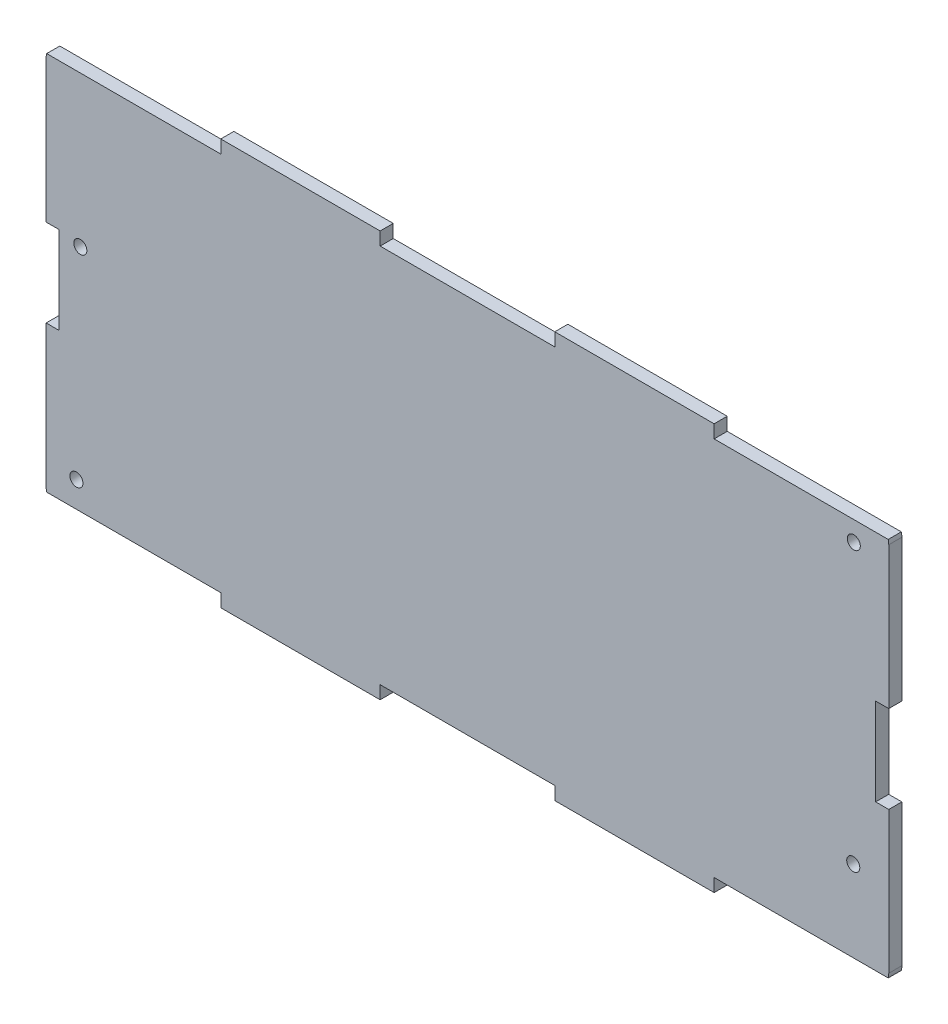
ISO-10303-21;
HEADER;
FILE_DESCRIPTION(('STEP AP214'),'2;1');
FILE_NAME('part.step','',(''),(''),'','','');
FILE_SCHEMA(('AUTOMOTIVE_DESIGN { 1 0 10303 214 1 1 1 1 }'));
ENDSEC;
DATA;
#1=APPLICATION_CONTEXT('core data for automotive mechanical design processes');
#2=APPLICATION_PROTOCOL_DEFINITION('international standard','automotive_design',2000,#1);
#3=PRODUCT_CONTEXT('',#1,'mechanical');
#4=PRODUCT('Part','Part','',(#3));
#5=PRODUCT_RELATED_PRODUCT_CATEGORY('part','',(#4));
#6=PRODUCT_DEFINITION_FORMATION('','',#4);
#7=PRODUCT_DEFINITION_CONTEXT('part definition',#1,'design');
#8=PRODUCT_DEFINITION('design','',#6,#7);
#9=PRODUCT_DEFINITION_SHAPE('','',#8);
#10=(LENGTH_UNIT() NAMED_UNIT(*) SI_UNIT(.MILLI.,.METRE.));
#11=(NAMED_UNIT(*) PLANE_ANGLE_UNIT() SI_UNIT($,.RADIAN.));
#12=(NAMED_UNIT(*) SI_UNIT($,.STERADIAN.) SOLID_ANGLE_UNIT());
#13=UNCERTAINTY_MEASURE_WITH_UNIT(LENGTH_MEASURE(1.E-05),#10,'distance_accuracy_value','');
#14=(GEOMETRIC_REPRESENTATION_CONTEXT(3) GLOBAL_UNCERTAINTY_ASSIGNED_CONTEXT((#13)) GLOBAL_UNIT_ASSIGNED_CONTEXT((#10,
#11,#12)) REPRESENTATION_CONTEXT('',''));
#15=CARTESIAN_POINT('',(0.,0.,0.));
#16=DIRECTION('',(0.,0.,1.));
#17=DIRECTION('',(1.,0.,0.));
#18=AXIS2_PLACEMENT_3D('',#15,#16,#17);
#19=CARTESIAN_POINT('',(-92.5,46.5,3.));
#20=DIRECTION('',(0.,-1.,0.));
#21=DIRECTION('',(0.,0.,-1.));
#22=AXIS2_PLACEMENT_3D('',#19,#20,#21);
#23=PLANE('',#22);
#24=DIRECTION('',(-1.,0.,0.));
#25=VECTOR('',#24,1.);
#26=CARTESIAN_POINT('',(-92.5,46.5,3.));
#27=LINE('',#26,#25);
#28=CARTESIAN_POINT('',(56.5,46.5,3.));
#29=VERTEX_POINT('',#28);
#30=CARTESIAN_POINT('',(20.,46.5,3.));
#31=VERTEX_POINT('',#30);
#32=EDGE_CURVE('E480',#29,#31,#27,.T.);
#33=ORIENTED_EDGE('',*,*,#32,.F.);
#34=DIRECTION('',(0.,0.,1.));
#35=VECTOR('',#34,1.);
#36=CARTESIAN_POINT('',(56.5,46.5,0.));
#37=LINE('',#36,#35);
#38=CARTESIAN_POINT('',(56.5,46.5,0.));
#39=VERTEX_POINT('',#38);
#40=EDGE_CURVE('E429',#39,#29,#37,.T.);
#41=ORIENTED_EDGE('',*,*,#40,.F.);
#42=DIRECTION('',(-1.,0.,0.));
#43=VECTOR('',#42,1.);
#44=CARTESIAN_POINT('',(-92.5,46.5,0.));
#45=LINE('',#44,#43);
#46=CARTESIAN_POINT('',(20.,46.5,0.));
#47=VERTEX_POINT('',#46);
#48=EDGE_CURVE('E320',#39,#47,#45,.T.);
#49=ORIENTED_EDGE('',*,*,#48,.T.);
#50=DIRECTION('',(0.,0.,1.));
#51=VECTOR('',#50,1.);
#52=CARTESIAN_POINT('',(20.,46.5,0.));
#53=LINE('',#52,#51);
#54=EDGE_CURVE('E391',#47,#31,#53,.T.);
#55=ORIENTED_EDGE('',*,*,#54,.T.);
#56=EDGE_LOOP('',(#33,#41,#49,#55));
#57=FACE_BOUND('',#56,.T.);
#58=ADVANCED_FACE('F33',(#57),#23,.F.);
#59=CARTESIAN_POINT('',(-96.5,42.5,3.));
#60=DIRECTION('',(1.,0.,0.));
#61=DIRECTION('',(0.,1.,0.));
#62=AXIS2_PLACEMENT_3D('',#59,#60,#61);
#63=PLANE('',#62);
#64=DIRECTION('',(0.,-1.,0.));
#65=VECTOR('',#64,1.);
#66=CARTESIAN_POINT('',(-96.5,42.5,3.));
#67=LINE('',#66,#65);
#68=CARTESIAN_POINT('',(-96.5,-10.,3.));
#69=VERTEX_POINT('',#68);
#70=CARTESIAN_POINT('',(-96.5,-42.5,3.));
#71=VERTEX_POINT('',#70);
#72=EDGE_CURVE('E482',#69,#71,#67,.T.);
#73=ORIENTED_EDGE('',*,*,#72,.F.);
#74=DIRECTION('',(0.,0.,1.));
#75=VECTOR('',#74,1.);
#76=CARTESIAN_POINT('',(-96.5,-10.,0.));
#77=LINE('',#76,#75);
#78=CARTESIAN_POINT('',(-96.5,-10.,0.));
#79=VERTEX_POINT('',#78);
#80=EDGE_CURVE('E455',#79,#69,#77,.T.);
#81=ORIENTED_EDGE('',*,*,#80,.F.);
#82=DIRECTION('',(0.,-1.,0.));
#83=VECTOR('',#82,1.);
#84=CARTESIAN_POINT('',(-96.5,42.5,0.));
#85=LINE('',#84,#83);
#86=CARTESIAN_POINT('',(-96.5,-42.5,0.));
#87=VERTEX_POINT('',#86);
#88=EDGE_CURVE('E319',#79,#87,#85,.T.);
#89=ORIENTED_EDGE('',*,*,#88,.T.);
#90=DIRECTION('',(0.,0.,-1.));
#91=VECTOR('',#90,1.);
#92=CARTESIAN_POINT('',(-96.5,-42.5,3.));
#93=LINE('',#92,#91);
#94=EDGE_CURVE('E290',#71,#87,#93,.T.);
#95=ORIENTED_EDGE('',*,*,#94,.F.);
#96=EDGE_LOOP('',(#73,#81,#89,#95));
#97=FACE_BOUND('',#96,.T.);
#98=ADVANCED_FACE('F601',(#97),#63,.F.);
#99=CARTESIAN_POINT('',(-92.5,-46.5,3.));
#100=DIRECTION('',(0.,1.,0.));
#101=DIRECTION('',(0.,0.,1.));
#102=AXIS2_PLACEMENT_3D('',#99,#100,#101);
#103=PLANE('',#102);
#104=DIRECTION('',(1.,0.,0.));
#105=VECTOR('',#104,1.);
#106=CARTESIAN_POINT('',(-92.5,-46.5,3.));
#107=LINE('',#106,#105);
#108=CARTESIAN_POINT('',(-56.5,-46.5,3.));
#109=VERTEX_POINT('',#108);
#110=CARTESIAN_POINT('',(-20.,-46.5000000000001,3.));
#111=VERTEX_POINT('',#110);
#112=EDGE_CURVE('E491',#109,#111,#107,.T.);
#113=ORIENTED_EDGE('',*,*,#112,.F.);
#114=DIRECTION('',(0.,0.,1.));
#115=VECTOR('',#114,1.);
#116=CARTESIAN_POINT('',(-56.5,-46.5,0.));
#117=LINE('',#116,#115);
#118=CARTESIAN_POINT('',(-56.5,-46.5,0.));
#119=VERTEX_POINT('',#118);
#120=EDGE_CURVE('E268',#119,#109,#117,.T.);
#121=ORIENTED_EDGE('',*,*,#120,.F.);
#122=DIRECTION('',(1.,0.,0.));
#123=VECTOR('',#122,1.);
#124=CARTESIAN_POINT('',(-92.5,-46.5,0.));
#125=LINE('',#124,#123);
#126=CARTESIAN_POINT('',(-20.,-46.5000000000001,0.));
#127=VERTEX_POINT('',#126);
#128=EDGE_CURVE('E261',#119,#127,#125,.T.);
#129=ORIENTED_EDGE('',*,*,#128,.T.);
#130=DIRECTION('',(0.,0.,1.));
#131=VECTOR('',#130,1.);
#132=CARTESIAN_POINT('',(-20.,-46.5000000000001,0.));
#133=LINE('',#132,#131);
#134=EDGE_CURVE('E241',#127,#111,#133,.T.);
#135=ORIENTED_EDGE('',*,*,#134,.T.);
#136=EDGE_LOOP('',(#113,#121,#129,#135));
#137=FACE_BOUND('',#136,.T.);
#138=ADVANCED_FACE('F267',(#137),#103,.F.);
#139=CARTESIAN_POINT('',(96.5,42.5,3.));
#140=DIRECTION('',(-1.,0.,0.));
#141=DIRECTION('',(0.,0.,1.));
#142=AXIS2_PLACEMENT_3D('',#139,#140,#141);
#143=PLANE('',#142);
#144=DIRECTION('',(0.,1.,0.));
#145=VECTOR('',#144,1.);
#146=CARTESIAN_POINT('',(96.5,42.5,0.));
#147=LINE('',#146,#145);
#148=CARTESIAN_POINT('',(96.5,-42.5,0.));
#149=VERTEX_POINT('',#148);
#150=CARTESIAN_POINT('',(96.5,-9.99999999999997,0.));
#151=VERTEX_POINT('',#150);
#152=EDGE_CURVE('E279',#149,#151,#147,.T.);
#153=ORIENTED_EDGE('',*,*,#152,.T.);
#154=DIRECTION('',(0.,0.,1.));
#155=VECTOR('',#154,1.);
#156=CARTESIAN_POINT('',(96.5,-9.99999999999997,0.));
#157=LINE('',#156,#155);
#158=CARTESIAN_POINT('',(96.5,-9.99999999999997,3.));
#159=VERTEX_POINT('',#158);
#160=EDGE_CURVE('E349',#151,#159,#157,.T.);
#161=ORIENTED_EDGE('',*,*,#160,.T.);
#162=DIRECTION('',(0.,1.,0.));
#163=VECTOR('',#162,1.);
#164=CARTESIAN_POINT('',(96.5,42.5,3.));
#165=LINE('',#164,#163);
#166=CARTESIAN_POINT('',(96.5,-42.5,3.));
#167=VERTEX_POINT('',#166);
#168=EDGE_CURVE('E287',#167,#159,#165,.T.);
#169=ORIENTED_EDGE('',*,*,#168,.F.);
#170=DIRECTION('',(0.,0.,-1.));
#171=VECTOR('',#170,1.);
#172=CARTESIAN_POINT('',(96.5,-42.5,3.));
#173=LINE('',#172,#171);
#174=EDGE_CURVE('E286',#167,#149,#173,.T.);
#175=ORIENTED_EDGE('',*,*,#174,.T.);
#176=EDGE_LOOP('',(#153,#161,#169,#175));
#177=FACE_BOUND('',#176,.T.);
#178=ADVANCED_FACE('F551',(#177),#143,.F.);
#179=CARTESIAN_POINT('',(92.5,42.5,3.));
#180=DIRECTION('',(0.,0.,-1.));
#181=DIRECTION('',(-1.,0.,0.));
#182=AXIS2_PLACEMENT_3D('',#179,#180,#181);
#183=CYLINDRICAL_SURFACE('',#182,4.);
#184=CARTESIAN_POINT('',(92.5,42.5,0.));
#185=DIRECTION('',(0.,0.,1.));
#186=DIRECTION('',(-1.,0.,0.));
#187=AXIS2_PLACEMENT_3D('',#184,#185,#186);
#188=CIRCLE('',#187,4.);
#189=CARTESIAN_POINT('',(96.5,42.5,0.));
#190=VERTEX_POINT('',#189);
#191=CARTESIAN_POINT('',(96.3729833462074,43.5,0.));
#192=VERTEX_POINT('',#191);
#193=EDGE_CURVE('E474',#190,#192,#188,.T.);
#194=ORIENTED_EDGE('',*,*,#193,.T.);
#195=DIRECTION('',(0.,0.,-1.));
#196=VECTOR('',#195,1.);
#197=CARTESIAN_POINT('',(96.3729833462074,43.5,3.));
#198=LINE('',#197,#196);
#199=CARTESIAN_POINT('',(96.3729833462074,43.5,3.));
#200=VERTEX_POINT('',#199);
#201=EDGE_CURVE('E470',#192,#200,#198,.F.);
#202=ORIENTED_EDGE('',*,*,#201,.T.);
#203=CARTESIAN_POINT('',(92.5,42.5,3.));
#204=DIRECTION('',(0.,0.,1.));
#205=DIRECTION('',(-1.,0.,0.));
#206=AXIS2_PLACEMENT_3D('',#203,#204,#205);
#207=CIRCLE('',#206,4.);
#208=CARTESIAN_POINT('',(96.5,42.5,3.));
#209=VERTEX_POINT('',#208);
#210=EDGE_CURVE('E282',#209,#200,#207,.T.);
#211=ORIENTED_EDGE('',*,*,#210,.F.);
#212=DIRECTION('',(0.,0.,-1.));
#213=VECTOR('',#212,1.);
#214=CARTESIAN_POINT('',(96.5,42.5,3.));
#215=LINE('',#214,#213);
#216=EDGE_CURVE('E283',#209,#190,#215,.T.);
#217=ORIENTED_EDGE('',*,*,#216,.T.);
#218=EDGE_LOOP('',(#194,#202,#211,#217));
#219=FACE_BOUND('',#218,.T.);
#220=ADVANCED_FACE('F35',(#219),#183,.T.);
#221=CARTESIAN_POINT('',(-20.,46.5,3.));
#222=VERTEX_POINT('',#221);
#223=CARTESIAN_POINT('',(-56.5,46.5,3.));
#224=VERTEX_POINT('',#223);
#225=EDGE_CURVE('E477',#222,#224,#27,.T.);
#226=ORIENTED_EDGE('',*,*,#225,.F.);
#227=DIRECTION('',(0.,0.,1.));
#228=VECTOR('',#227,1.);
#229=CARTESIAN_POINT('',(-20.,46.5,0.));
#230=LINE('',#229,#228);
#231=CARTESIAN_POINT('',(-20.,46.5,0.));
#232=VERTEX_POINT('',#231);
#233=EDGE_CURVE('E405',#232,#222,#230,.T.);
#234=ORIENTED_EDGE('',*,*,#233,.F.);
#235=CARTESIAN_POINT('',(-56.5,46.5,0.));
#236=VERTEX_POINT('',#235);
#237=EDGE_CURVE('E323',#232,#236,#45,.T.);
#238=ORIENTED_EDGE('',*,*,#237,.T.);
#239=DIRECTION('',(0.,0.,1.));
#240=VECTOR('',#239,1.);
#241=CARTESIAN_POINT('',(-56.5,46.5,0.));
#242=LINE('',#241,#240);
#243=EDGE_CURVE('E313',#236,#224,#242,.T.);
#244=ORIENTED_EDGE('',*,*,#243,.T.);
#245=EDGE_LOOP('',(#226,#234,#238,#244));
#246=FACE_BOUND('',#245,.T.);
#247=ADVANCED_FACE('F504',(#246),#23,.F.);
#248=CARTESIAN_POINT('',(-92.5,42.5,3.));
#249=DIRECTION('',(0.,0.,-1.));
#250=DIRECTION('',(-1.,0.,0.));
#251=AXIS2_PLACEMENT_3D('',#248,#249,#250);
#252=CYLINDRICAL_SURFACE('',#251,4.);
#253=CARTESIAN_POINT('',(-92.5,42.5,3.));
#254=DIRECTION('',(0.,0.,1.));
#255=DIRECTION('',(-1.,0.,0.));
#256=AXIS2_PLACEMENT_3D('',#253,#254,#255);
#257=CIRCLE('',#256,4.);
#258=CARTESIAN_POINT('',(-96.3729833462075,43.5,3.));
#259=VERTEX_POINT('',#258);
#260=CARTESIAN_POINT('',(-96.5,42.5,3.));
#261=VERTEX_POINT('',#260);
#262=EDGE_CURVE('E311',#259,#261,#257,.T.);
#263=ORIENTED_EDGE('',*,*,#262,.F.);
#264=DIRECTION('',(0.,0.,-1.));
#265=VECTOR('',#264,1.);
#266=CARTESIAN_POINT('',(-96.3729833462075,43.5,3.));
#267=LINE('',#266,#265);
#268=CARTESIAN_POINT('',(-96.3729833462075,43.5,0.));
#269=VERTEX_POINT('',#268);
#270=EDGE_CURVE('E300',#259,#269,#267,.T.);
#271=ORIENTED_EDGE('',*,*,#270,.T.);
#272=CARTESIAN_POINT('',(-92.5,42.5,0.));
#273=DIRECTION('',(0.,0.,1.));
#274=DIRECTION('',(-1.,0.,0.));
#275=AXIS2_PLACEMENT_3D('',#272,#273,#274);
#276=CIRCLE('',#275,4.);
#277=CARTESIAN_POINT('',(-96.5,42.5,0.));
#278=VERTEX_POINT('',#277);
#279=EDGE_CURVE('E310',#269,#278,#276,.T.);
#280=ORIENTED_EDGE('',*,*,#279,.T.);
#281=DIRECTION('',(0.,0.,-1.));
#282=VECTOR('',#281,1.);
#283=CARTESIAN_POINT('',(-96.5,42.5,3.));
#284=LINE('',#283,#282);
#285=EDGE_CURVE('E293',#261,#278,#284,.T.);
#286=ORIENTED_EDGE('',*,*,#285,.F.);
#287=EDGE_LOOP('',(#263,#271,#280,#286));
#288=FACE_BOUND('',#287,.T.);
#289=ADVANCED_FACE('F308',(#288),#252,.T.);
#290=CARTESIAN_POINT('',(-96.5,9.99999999999998,0.));
#291=VERTEX_POINT('',#290);
#292=EDGE_CURVE('E318',#278,#291,#85,.T.);
#293=ORIENTED_EDGE('',*,*,#292,.T.);
#294=DIRECTION('',(0.,0.,1.));
#295=VECTOR('',#294,1.);
#296=CARTESIAN_POINT('',(-96.5,9.99999999999998,0.));
#297=LINE('',#296,#295);
#298=CARTESIAN_POINT('',(-96.5,9.99999999999998,3.));
#299=VERTEX_POINT('',#298);
#300=EDGE_CURVE('E457',#291,#299,#297,.T.);
#301=ORIENTED_EDGE('',*,*,#300,.T.);
#302=EDGE_CURVE('E483',#261,#299,#67,.T.);
#303=ORIENTED_EDGE('',*,*,#302,.F.);
#304=ORIENTED_EDGE('',*,*,#285,.T.);
#305=EDGE_LOOP('',(#293,#301,#303,#304));
#306=FACE_BOUND('',#305,.T.);
#307=ADVANCED_FACE('F607',(#306),#63,.F.);
#308=CARTESIAN_POINT('',(-92.5,-42.5,3.));
#309=DIRECTION('',(0.,0.,-1.));
#310=DIRECTION('',(-1.,0.,0.));
#311=AXIS2_PLACEMENT_3D('',#308,#309,#310);
#312=CYLINDRICAL_SURFACE('',#311,4.);
#313=CARTESIAN_POINT('',(-92.5,-42.5,0.));
#314=DIRECTION('',(0.,0.,1.));
#315=DIRECTION('',(-1.,0.,0.));
#316=AXIS2_PLACEMENT_3D('',#313,#314,#315);
#317=CIRCLE('',#316,4.);
#318=CARTESIAN_POINT('',(-96.3729833462074,-43.5,0.));
#319=VERTEX_POINT('',#318);
#320=EDGE_CURVE('E275',#87,#319,#317,.T.);
#321=ORIENTED_EDGE('',*,*,#320,.T.);
#322=DIRECTION('',(0.,0.,-1.));
#323=VECTOR('',#322,1.);
#324=CARTESIAN_POINT('',(-96.3729833462074,-43.5,3.));
#325=LINE('',#324,#323);
#326=CARTESIAN_POINT('',(-96.3729833462074,-43.5,3.));
#327=VERTEX_POINT('',#326);
#328=EDGE_CURVE('E334',#319,#327,#325,.F.);
#329=ORIENTED_EDGE('',*,*,#328,.T.);
#330=CARTESIAN_POINT('',(-92.5,-42.5,3.));
#331=DIRECTION('',(0.,0.,1.));
#332=DIRECTION('',(-1.,0.,0.));
#333=AXIS2_PLACEMENT_3D('',#330,#331,#332);
#334=CIRCLE('',#333,4.);
#335=EDGE_CURVE('E486',#71,#327,#334,.T.);
#336=ORIENTED_EDGE('',*,*,#335,.F.);
#337=ORIENTED_EDGE('',*,*,#94,.T.);
#338=EDGE_LOOP('',(#321,#329,#336,#337));
#339=FACE_BOUND('',#338,.T.);
#340=ADVANCED_FACE('F332',(#339),#312,.T.);
#341=CARTESIAN_POINT('',(20.,-46.5000000000001,3.));
#342=VERTEX_POINT('',#341);
#343=CARTESIAN_POINT('',(56.5,-46.5,3.));
#344=VERTEX_POINT('',#343);
#345=EDGE_CURVE('E488',#342,#344,#107,.T.);
#346=ORIENTED_EDGE('',*,*,#345,.F.);
#347=DIRECTION('',(0.,0.,1.));
#348=VECTOR('',#347,1.);
#349=CARTESIAN_POINT('',(20.,-46.5000000000001,0.));
#350=LINE('',#349,#348);
#351=CARTESIAN_POINT('',(20.,-46.5000000000001,0.));
#352=VERTEX_POINT('',#351);
#353=EDGE_CURVE('E252',#352,#342,#350,.T.);
#354=ORIENTED_EDGE('',*,*,#353,.F.);
#355=CARTESIAN_POINT('',(56.5,-46.5,0.));
#356=VERTEX_POINT('',#355);
#357=EDGE_CURVE('E270',#352,#356,#125,.T.);
#358=ORIENTED_EDGE('',*,*,#357,.T.);
#359=DIRECTION('',(0.,0.,1.));
#360=VECTOR('',#359,1.);
#361=CARTESIAN_POINT('',(56.5,-46.5,0.));
#362=LINE('',#361,#360);
#363=EDGE_CURVE('E395',#356,#344,#362,.T.);
#364=ORIENTED_EDGE('',*,*,#363,.T.);
#365=EDGE_LOOP('',(#346,#354,#358,#364));
#366=FACE_BOUND('',#365,.T.);
#367=ADVANCED_FACE('F573',(#366),#103,.F.);
#368=CARTESIAN_POINT('',(92.5,-42.5,3.));
#369=DIRECTION('',(0.,0.,-1.));
#370=DIRECTION('',(-1.,0.,0.));
#371=AXIS2_PLACEMENT_3D('',#368,#369,#370);
#372=CYLINDRICAL_SURFACE('',#371,4.);
#373=CARTESIAN_POINT('',(92.5,-42.5,3.));
#374=DIRECTION('',(0.,0.,1.));
#375=DIRECTION('',(-1.,0.,0.));
#376=AXIS2_PLACEMENT_3D('',#373,#374,#375);
#377=CIRCLE('',#376,4.);
#378=CARTESIAN_POINT('',(96.3729833462074,-43.5,3.));
#379=VERTEX_POINT('',#378);
#380=EDGE_CURVE('E492',#379,#167,#377,.T.);
#381=ORIENTED_EDGE('',*,*,#380,.F.);
#382=DIRECTION('',(0.,0.,-1.));
#383=VECTOR('',#382,1.);
#384=CARTESIAN_POINT('',(96.3729833462074,-43.5,3.));
#385=LINE('',#384,#383);
#386=CARTESIAN_POINT('',(96.3729833462074,-43.5,0.));
#387=VERTEX_POINT('',#386);
#388=EDGE_CURVE('E312',#379,#387,#385,.T.);
#389=ORIENTED_EDGE('',*,*,#388,.T.);
#390=CARTESIAN_POINT('',(92.5,-42.5,0.));
#391=DIRECTION('',(0.,0.,1.));
#392=DIRECTION('',(-1.,0.,0.));
#393=AXIS2_PLACEMENT_3D('',#390,#391,#392);
#394=CIRCLE('',#393,4.);
#395=EDGE_CURVE('E269',#387,#149,#394,.T.);
#396=ORIENTED_EDGE('',*,*,#395,.T.);
#397=ORIENTED_EDGE('',*,*,#174,.F.);
#398=EDGE_LOOP('',(#381,#389,#396,#397));
#399=FACE_BOUND('',#398,.T.);
#400=ADVANCED_FACE('F556',(#399),#372,.T.);
#401=CARTESIAN_POINT('',(96.5,10.,3.));
#402=VERTEX_POINT('',#401);
#403=EDGE_CURVE('E494',#402,#209,#165,.T.);
#404=ORIENTED_EDGE('',*,*,#403,.F.);
#405=DIRECTION('',(0.,0.,1.));
#406=VECTOR('',#405,1.);
#407=CARTESIAN_POINT('',(96.5,10.,0.));
#408=LINE('',#407,#406);
#409=CARTESIAN_POINT('',(96.5,10.,0.));
#410=VERTEX_POINT('',#409);
#411=EDGE_CURVE('E359',#410,#402,#408,.T.);
#412=ORIENTED_EDGE('',*,*,#411,.F.);
#413=EDGE_CURVE('E272',#410,#190,#147,.T.);
#414=ORIENTED_EDGE('',*,*,#413,.T.);
#415=ORIENTED_EDGE('',*,*,#216,.F.);
#416=EDGE_LOOP('',(#404,#412,#414,#415));
#417=FACE_BOUND('',#416,.T.);
#418=ADVANCED_FACE('F538',(#417),#143,.F.);
#419=CARTESIAN_POINT('',(92.5,42.5,3.));
#420=DIRECTION('',(0.,0.,-1.));
#421=DIRECTION('',(-1.,0.,0.));
#422=AXIS2_PLACEMENT_3D('',#419,#420,#421);
#423=PLANE('',#422);
#424=CARTESIAN_POINT('',(-88.674,9.01052304396474,3.));
#425=DIRECTION('',(0.,0.,1.));
#426=DIRECTION('',(1.,0.,0.));
#427=AXIS2_PLACEMENT_3D('',#424,#425,#426);
#428=CIRCLE('',#427,1.5);
#429=CARTESIAN_POINT('',(-87.174,9.01052304396474,3.));
#430=VERTEX_POINT('',#429);
#431=EDGE_CURVE('E377',#430,#430,#428,.T.);
#432=ORIENTED_EDGE('',*,*,#431,.F.);
#433=EDGE_LOOP('',(#432));
#434=FACE_BOUND('',#433,.T.);
#435=CARTESIAN_POINT('',(-89.563,-37.5984769560353,3.));
#436=DIRECTION('',(0.,0.,1.));
#437=DIRECTION('',(1.,0.,0.));
#438=AXIS2_PLACEMENT_3D('',#435,#436,#437);
#439=CIRCLE('',#438,1.5);
#440=CARTESIAN_POINT('',(-88.063,-37.5984769560353,3.));
#441=VERTEX_POINT('',#440);
#442=EDGE_CURVE('E884',#441,#441,#439,.T.);
#443=ORIENTED_EDGE('',*,*,#442,.F.);
#444=EDGE_LOOP('',(#443));
#445=FACE_BOUND('',#444,.T.);
#446=CARTESIAN_POINT('',(88.3639999999999,-24.8984769560353,3.));
#447=DIRECTION('',(0.,0.,1.));
#448=DIRECTION('',(1.,0.,0.));
#449=AXIS2_PLACEMENT_3D('',#446,#447,#448);
#450=CIRCLE('',#449,1.5);
#451=CARTESIAN_POINT('',(89.8639999999999,-24.8984769560353,3.));
#452=VERTEX_POINT('',#451);
#453=EDGE_CURVE('E888',#452,#452,#450,.T.);
#454=ORIENTED_EDGE('',*,*,#453,.F.);
#455=EDGE_LOOP('',(#454));
#456=FACE_BOUND('',#455,.T.);
#457=CARTESIAN_POINT('',(88.4910000000001,38.9825230439646,3.));
#458=DIRECTION('',(0.,0.,1.));
#459=DIRECTION('',(1.,0.,0.));
#460=AXIS2_PLACEMENT_3D('',#457,#458,#459);
#461=CIRCLE('',#460,1.50000000000001);
#462=CARTESIAN_POINT('',(89.9910000000001,38.9825230439646,3.));
#463=VERTEX_POINT('',#462);
#464=EDGE_CURVE('E891',#463,#463,#461,.T.);
#465=ORIENTED_EDGE('',*,*,#464,.F.);
#466=EDGE_LOOP('',(#465));
#467=FACE_BOUND('',#466,.T.);
#468=ORIENTED_EDGE('',*,*,#168,.T.);
#469=DIRECTION('',(1.,0.,0.));
#470=VECTOR('',#469,1.);
#471=CARTESIAN_POINT('',(96.5,-9.99999999999997,3.));
#472=LINE('',#471,#470);
#473=CARTESIAN_POINT('',(93.5,-9.99999999999997,3.));
#474=VERTEX_POINT('',#473);
#475=EDGE_CURVE('E355',#474,#159,#472,.T.);
#476=ORIENTED_EDGE('',*,*,#475,.F.);
#477=DIRECTION('',(0.,-1.,0.));
#478=VECTOR('',#477,1.);
#479=CARTESIAN_POINT('',(93.5,10.,3.));
#480=LINE('',#479,#478);
#481=CARTESIAN_POINT('',(93.5,10.,3.));
#482=VERTEX_POINT('',#481);
#483=EDGE_CURVE('E363',#482,#474,#480,.T.);
#484=ORIENTED_EDGE('',*,*,#483,.F.);
#485=DIRECTION('',(-1.,0.,0.));
#486=VECTOR('',#485,1.);
#487=CARTESIAN_POINT('',(96.5,10.,3.));
#488=LINE('',#487,#486);
#489=EDGE_CURVE('E360',#402,#482,#488,.T.);
#490=ORIENTED_EDGE('',*,*,#489,.F.);
#491=ORIENTED_EDGE('',*,*,#403,.T.);
#492=ORIENTED_EDGE('',*,*,#210,.T.);
#493=DIRECTION('',(1.,0.,0.));
#494=VECTOR('',#493,1.);
#495=CARTESIAN_POINT('',(96.5,43.5,3.));
#496=LINE('',#495,#494);
#497=CARTESIAN_POINT('',(56.5,43.5,3.));
#498=VERTEX_POINT('',#497);
#499=EDGE_CURVE('E426',#498,#200,#496,.T.);
#500=ORIENTED_EDGE('',*,*,#499,.F.);
#501=DIRECTION('',(0.,-1.,0.));
#502=VECTOR('',#501,1.);
#503=CARTESIAN_POINT('',(56.5,46.5,3.));
#504=LINE('',#503,#502);
#505=EDGE_CURVE('E430',#29,#498,#504,.T.);
#506=ORIENTED_EDGE('',*,*,#505,.F.);
#507=ORIENTED_EDGE('',*,*,#32,.T.);
#508=DIRECTION('',(0.,1.,0.));
#509=VECTOR('',#508,1.);
#510=CARTESIAN_POINT('',(20.,46.5,3.));
#511=LINE('',#510,#509);
#512=CARTESIAN_POINT('',(19.9999999999999,43.5,3.));
#513=VERTEX_POINT('',#512);
#514=EDGE_CURVE('E392',#513,#31,#511,.T.);
#515=ORIENTED_EDGE('',*,*,#514,.F.);
#516=DIRECTION('',(1.,0.,0.));
#517=VECTOR('',#516,1.);
#518=CARTESIAN_POINT('',(-20.,43.5,3.));
#519=LINE('',#518,#517);
#520=CARTESIAN_POINT('',(-20.,43.5,3.));
#521=VERTEX_POINT('',#520);
#522=EDGE_CURVE('E385',#521,#513,#519,.T.);
#523=ORIENTED_EDGE('',*,*,#522,.F.);
#524=DIRECTION('',(0.,-1.,0.));
#525=VECTOR('',#524,1.);
#526=CARTESIAN_POINT('',(-20.,46.5,3.));
#527=LINE('',#526,#525);
#528=EDGE_CURVE('E394',#222,#521,#527,.T.);
#529=ORIENTED_EDGE('',*,*,#528,.F.);
#530=ORIENTED_EDGE('',*,*,#225,.T.);
#531=DIRECTION('',(0.,1.,0.));
#532=VECTOR('',#531,1.);
#533=CARTESIAN_POINT('',(-56.5,46.5,3.));
#534=LINE('',#533,#532);
#535=CARTESIAN_POINT('',(-56.5,43.5,3.));
#536=VERTEX_POINT('',#535);
#537=EDGE_CURVE('E462',#536,#224,#534,.T.);
#538=ORIENTED_EDGE('',*,*,#537,.F.);
#539=DIRECTION('',(1.,0.,0.));
#540=VECTOR('',#539,1.);
#541=CARTESIAN_POINT('',(-96.5,43.5,3.));
#542=LINE('',#541,#540);
#543=EDGE_CURVE('E437',#259,#536,#542,.T.);
#544=ORIENTED_EDGE('',*,*,#543,.F.);
#545=ORIENTED_EDGE('',*,*,#262,.T.);
#546=ORIENTED_EDGE('',*,*,#302,.T.);
#547=DIRECTION('',(-1.,0.,0.));
#548=VECTOR('',#547,1.);
#549=CARTESIAN_POINT('',(-96.5,9.99999999999998,3.));
#550=LINE('',#549,#548);
#551=CARTESIAN_POINT('',(-93.5,9.99999999999998,3.));
#552=VERTEX_POINT('',#551);
#553=EDGE_CURVE('E450',#552,#299,#550,.T.);
#554=ORIENTED_EDGE('',*,*,#553,.F.);
#555=DIRECTION('',(0.,1.,0.));
#556=VECTOR('',#555,1.);
#557=CARTESIAN_POINT('',(-93.5,9.99999999999998,3.));
#558=LINE('',#557,#556);
#559=CARTESIAN_POINT('',(-93.5,-10.,3.));
#560=VERTEX_POINT('',#559);
#561=EDGE_CURVE('E402',#560,#552,#558,.T.);
#562=ORIENTED_EDGE('',*,*,#561,.F.);
#563=DIRECTION('',(1.,0.,0.));
#564=VECTOR('',#563,1.);
#565=CARTESIAN_POINT('',(-96.5,-10.,3.));
#566=LINE('',#565,#564);
#567=EDGE_CURVE('E443',#69,#560,#566,.T.);
#568=ORIENTED_EDGE('',*,*,#567,.F.);
#569=ORIENTED_EDGE('',*,*,#72,.T.);
#570=ORIENTED_EDGE('',*,*,#335,.T.);
#571=DIRECTION('',(-1.,0.,0.));
#572=VECTOR('',#571,1.);
#573=CARTESIAN_POINT('',(-96.5,-43.5,3.));
#574=LINE('',#573,#572);
#575=CARTESIAN_POINT('',(-56.5,-43.5,3.));
#576=VERTEX_POINT('',#575);
#577=EDGE_CURVE('E343',#576,#327,#574,.T.);
#578=ORIENTED_EDGE('',*,*,#577,.F.);
#579=DIRECTION('',(0.,1.,0.));
#580=VECTOR('',#579,1.);
#581=CARTESIAN_POINT('',(-56.5,-46.5,3.));
#582=LINE('',#581,#580);
#583=EDGE_CURVE('E346',#109,#576,#582,.T.);
#584=ORIENTED_EDGE('',*,*,#583,.F.);
#585=ORIENTED_EDGE('',*,*,#112,.T.);
#586=DIRECTION('',(0.,-1.,0.));
#587=VECTOR('',#586,1.);
#588=CARTESIAN_POINT('',(-20.,-46.5000000000001,3.));
#589=LINE('',#588,#587);
#590=CARTESIAN_POINT('',(-20.,-43.5,3.));
#591=VERTEX_POINT('',#590);
#592=EDGE_CURVE('E247',#591,#111,#589,.T.);
#593=ORIENTED_EDGE('',*,*,#592,.F.);
#594=DIRECTION('',(-1.,0.,0.));
#595=VECTOR('',#594,1.);
#596=CARTESIAN_POINT('',(-20.,-43.5,3.));
#597=LINE('',#596,#595);
#598=CARTESIAN_POINT('',(19.9999999999999,-43.5,3.));
#599=VERTEX_POINT('',#598);
#600=EDGE_CURVE('E264',#599,#591,#597,.T.);
#601=ORIENTED_EDGE('',*,*,#600,.F.);
#602=DIRECTION('',(0.,1.,0.));
#603=VECTOR('',#602,1.);
#604=CARTESIAN_POINT('',(20.,-46.5000000000001,3.));
#605=LINE('',#604,#603);
#606=EDGE_CURVE('E570',#342,#599,#605,.T.);
#607=ORIENTED_EDGE('',*,*,#606,.F.);
#608=ORIENTED_EDGE('',*,*,#345,.T.);
#609=DIRECTION('',(0.,-1.,0.));
#610=VECTOR('',#609,1.);
#611=CARTESIAN_POINT('',(56.5,-46.5,3.));
#612=LINE('',#611,#610);
#613=CARTESIAN_POINT('',(56.5,-43.5,3.));
#614=VERTEX_POINT('',#613);
#615=EDGE_CURVE('E413',#614,#344,#612,.T.);
#616=ORIENTED_EDGE('',*,*,#615,.F.);
#617=DIRECTION('',(-1.,0.,0.));
#618=VECTOR('',#617,1.);
#619=CARTESIAN_POINT('',(96.5,-43.5,3.));
#620=LINE('',#619,#618);
#621=EDGE_CURVE('E414',#379,#614,#620,.T.);
#622=ORIENTED_EDGE('',*,*,#621,.F.);
#623=ORIENTED_EDGE('',*,*,#380,.T.);
#624=EDGE_LOOP('',(#468,#476,#484,#490,#491,#492,#500,#506,#507,#515,#523,#529,#530,#538,#544,
#545,#546,#554,#562,#568,#569,#570,#578,#584,#585,#593,#601,#607,#608,#616,#622,#623));
#625=FACE_BOUND('',#624,.T.);
#626=ADVANCED_FACE('F509',(#434,#445,#456,#467,#625),#423,.F.);
#627=CARTESIAN_POINT('',(92.5,42.5,0.));
#628=DIRECTION('',(0.,0.,-1.));
#629=DIRECTION('',(-1.,0.,0.));
#630=AXIS2_PLACEMENT_3D('',#627,#628,#629);
#631=PLANE('',#630);
#632=CARTESIAN_POINT('',(-88.674,9.01052304396474,0.));
#633=DIRECTION('',(0.,0.,1.));
#634=DIRECTION('',(1.,0.,0.));
#635=AXIS2_PLACEMENT_3D('',#632,#633,#634);
#636=CIRCLE('',#635,1.5);
#637=CARTESIAN_POINT('',(-87.174,9.01052304396474,0.));
#638=VERTEX_POINT('',#637);
#639=EDGE_CURVE('E364',#638,#638,#636,.T.);
#640=ORIENTED_EDGE('',*,*,#639,.T.);
#641=EDGE_LOOP('',(#640));
#642=FACE_BOUND('',#641,.T.);
#643=DIRECTION('',(1.,0.,0.));
#644=VECTOR('',#643,1.);
#645=CARTESIAN_POINT('',(96.5,-9.99999999999997,0.));
#646=LINE('',#645,#644);
#647=CARTESIAN_POINT('',(93.5,-9.99999999999997,0.));
#648=VERTEX_POINT('',#647);
#649=EDGE_CURVE('E357',#648,#151,#646,.T.);
#650=ORIENTED_EDGE('',*,*,#649,.T.);
#651=ORIENTED_EDGE('',*,*,#152,.F.);
#652=ORIENTED_EDGE('',*,*,#395,.F.);
#653=DIRECTION('',(1.,0.,0.));
#654=VECTOR('',#653,1.);
#655=CARTESIAN_POINT('',(92.4999999999999,-43.5,0.));
#656=LINE('',#655,#654);
#657=CARTESIAN_POINT('',(56.5,-43.5,0.));
#658=VERTEX_POINT('',#657);
#659=EDGE_CURVE('E11',#658,#387,#656,.T.);
#660=ORIENTED_EDGE('',*,*,#659,.F.);
#661=DIRECTION('',(0.,-1.,0.));
#662=VECTOR('',#661,1.);
#663=CARTESIAN_POINT('',(56.5,-46.5,0.));
#664=LINE('',#663,#662);
#665=EDGE_CURVE('E409',#658,#356,#664,.T.);
#666=ORIENTED_EDGE('',*,*,#665,.T.);
#667=ORIENTED_EDGE('',*,*,#357,.F.);
#668=DIRECTION('',(0.,1.,0.));
#669=VECTOR('',#668,1.);
#670=CARTESIAN_POINT('',(20.,-46.5000000000001,0.));
#671=LINE('',#670,#669);
#672=CARTESIAN_POINT('',(20.,-43.5,0.));
#673=VERTEX_POINT('',#672);
#674=EDGE_CURVE('E263',#352,#673,#671,.T.);
#675=ORIENTED_EDGE('',*,*,#674,.T.);
#676=DIRECTION('',(-1.,0.,0.));
#677=VECTOR('',#676,1.);
#678=CARTESIAN_POINT('',(-20.,-43.5,0.));
#679=LINE('',#678,#677);
#680=CARTESIAN_POINT('',(-20.,-43.5,0.));
#681=VERTEX_POINT('',#680);
#682=EDGE_CURVE('E253',#673,#681,#679,.T.);
#683=ORIENTED_EDGE('',*,*,#682,.T.);
#684=DIRECTION('',(0.,-1.,0.));
#685=VECTOR('',#684,1.);
#686=CARTESIAN_POINT('',(-20.,-46.5000000000001,0.));
#687=LINE('',#686,#685);
#688=EDGE_CURVE('E244',#681,#127,#687,.T.);
#689=ORIENTED_EDGE('',*,*,#688,.T.);
#690=ORIENTED_EDGE('',*,*,#128,.F.);
#691=DIRECTION('',(0.,1.,0.));
#692=VECTOR('',#691,1.);
#693=CARTESIAN_POINT('',(-56.5,-46.5,0.));
#694=LINE('',#693,#692);
#695=CARTESIAN_POINT('',(-56.5,-43.5,0.));
#696=VERTEX_POINT('',#695);
#697=EDGE_CURVE('E339',#119,#696,#694,.T.);
#698=ORIENTED_EDGE('',*,*,#697,.T.);
#699=DIRECTION('',(-1.,0.,0.));
#700=VECTOR('',#699,1.);
#701=CARTESIAN_POINT('',(-96.5,-43.5,0.));
#702=LINE('',#701,#700);
#703=EDGE_CURVE('E56',#696,#319,#702,.T.);
#704=ORIENTED_EDGE('',*,*,#703,.T.);
#705=ORIENTED_EDGE('',*,*,#320,.F.);
#706=ORIENTED_EDGE('',*,*,#88,.F.);
#707=DIRECTION('',(1.,0.,0.));
#708=VECTOR('',#707,1.);
#709=CARTESIAN_POINT('',(-96.5,-10.,0.));
#710=LINE('',#709,#708);
#711=CARTESIAN_POINT('',(-93.5,-10.,0.));
#712=VERTEX_POINT('',#711);
#713=EDGE_CURVE('E445',#79,#712,#710,.T.);
#714=ORIENTED_EDGE('',*,*,#713,.T.);
#715=DIRECTION('',(0.,1.,0.));
#716=VECTOR('',#715,1.);
#717=CARTESIAN_POINT('',(-93.5,9.99999999999998,0.));
#718=LINE('',#717,#716);
#719=CARTESIAN_POINT('',(-93.5,9.99999999999998,0.));
#720=VERTEX_POINT('',#719);
#721=EDGE_CURVE('E439',#712,#720,#718,.T.);
#722=ORIENTED_EDGE('',*,*,#721,.T.);
#723=DIRECTION('',(-1.,0.,0.));
#724=VECTOR('',#723,1.);
#725=CARTESIAN_POINT('',(-96.5,9.99999999999998,0.));
#726=LINE('',#725,#724);
#727=EDGE_CURVE('E442',#720,#291,#726,.T.);
#728=ORIENTED_EDGE('',*,*,#727,.T.);
#729=ORIENTED_EDGE('',*,*,#292,.F.);
#730=ORIENTED_EDGE('',*,*,#279,.F.);
#731=DIRECTION('',(-1.,0.,0.));
#732=VECTOR('',#731,1.);
#733=CARTESIAN_POINT('',(92.5,43.5,0.));
#734=LINE('',#733,#732);
#735=CARTESIAN_POINT('',(-56.5,43.5,0.));
#736=VERTEX_POINT('',#735);
#737=EDGE_CURVE('E41',#736,#269,#734,.T.);
#738=ORIENTED_EDGE('',*,*,#737,.F.);
#739=DIRECTION('',(0.,1.,0.));
#740=VECTOR('',#739,1.);
#741=CARTESIAN_POINT('',(-56.5,46.5,0.));
#742=LINE('',#741,#740);
#743=EDGE_CURVE('E460',#736,#236,#742,.T.);
#744=ORIENTED_EDGE('',*,*,#743,.T.);
#745=ORIENTED_EDGE('',*,*,#237,.F.);
#746=DIRECTION('',(0.,-1.,0.));
#747=VECTOR('',#746,1.);
#748=CARTESIAN_POINT('',(-20.,46.5,0.));
#749=LINE('',#748,#747);
#750=CARTESIAN_POINT('',(-20.,43.5,0.));
#751=VERTEX_POINT('',#750);
#752=EDGE_CURVE('E384',#232,#751,#749,.T.);
#753=ORIENTED_EDGE('',*,*,#752,.T.);
#754=DIRECTION('',(1.,0.,0.));
#755=VECTOR('',#754,1.);
#756=CARTESIAN_POINT('',(-20.,43.5,0.));
#757=LINE('',#756,#755);
#758=CARTESIAN_POINT('',(19.9999999999999,43.5,0.));
#759=VERTEX_POINT('',#758);
#760=EDGE_CURVE('E388',#751,#759,#757,.T.);
#761=ORIENTED_EDGE('',*,*,#760,.T.);
#762=DIRECTION('',(0.,1.,0.));
#763=VECTOR('',#762,1.);
#764=CARTESIAN_POINT('',(20.,46.5,0.));
#765=LINE('',#764,#763);
#766=EDGE_CURVE('E381',#759,#47,#765,.T.);
#767=ORIENTED_EDGE('',*,*,#766,.T.);
#768=ORIENTED_EDGE('',*,*,#48,.F.);
#769=DIRECTION('',(0.,-1.,0.));
#770=VECTOR('',#769,1.);
#771=CARTESIAN_POINT('',(56.5,46.5,0.));
#772=LINE('',#771,#770);
#773=CARTESIAN_POINT('',(56.5,43.5,0.));
#774=VERTEX_POINT('',#773);
#775=EDGE_CURVE('E422',#39,#774,#772,.T.);
#776=ORIENTED_EDGE('',*,*,#775,.T.);
#777=DIRECTION('',(1.,0.,0.));
#778=VECTOR('',#777,1.);
#779=CARTESIAN_POINT('',(96.5,43.5,0.));
#780=LINE('',#779,#778);
#781=EDGE_CURVE('E425',#774,#192,#780,.T.);
#782=ORIENTED_EDGE('',*,*,#781,.T.);
#783=ORIENTED_EDGE('',*,*,#193,.F.);
#784=ORIENTED_EDGE('',*,*,#413,.F.);
#785=DIRECTION('',(-1.,0.,0.));
#786=VECTOR('',#785,1.);
#787=CARTESIAN_POINT('',(96.5,10.,0.));
#788=LINE('',#787,#786);
#789=CARTESIAN_POINT('',(93.5,10.,0.));
#790=VERTEX_POINT('',#789);
#791=EDGE_CURVE('E352',#410,#790,#788,.T.);
#792=ORIENTED_EDGE('',*,*,#791,.T.);
#793=DIRECTION('',(0.,-1.,0.));
#794=VECTOR('',#793,1.);
#795=CARTESIAN_POINT('',(93.5,10.,0.));
#796=LINE('',#795,#794);
#797=EDGE_CURVE('E48',#790,#648,#796,.T.);
#798=ORIENTED_EDGE('',*,*,#797,.T.);
#799=EDGE_LOOP('',(#650,#651,#652,#660,#666,#667,#675,#683,#689,#690,#698,#704,#705,#706,#714,
#722,#728,#729,#730,#738,#744,#745,#753,#761,#767,#768,#776,#782,#783,#784,#792,#798));
#800=FACE_BOUND('',#799,.T.);
#801=CARTESIAN_POINT('',(-89.563,-37.5984769560353,0.));
#802=DIRECTION('',(0.,0.,1.));
#803=DIRECTION('',(1.,0.,0.));
#804=AXIS2_PLACEMENT_3D('',#801,#802,#803);
#805=CIRCLE('',#804,1.5);
#806=CARTESIAN_POINT('',(-88.063,-37.5984769560353,0.));
#807=VERTEX_POINT('',#806);
#808=EDGE_CURVE('E380',#807,#807,#805,.T.);
#809=ORIENTED_EDGE('',*,*,#808,.T.);
#810=EDGE_LOOP('',(#809));
#811=FACE_BOUND('',#810,.T.);
#812=CARTESIAN_POINT('',(88.3639999999999,-24.8984769560353,0.));
#813=DIRECTION('',(0.,0.,1.));
#814=DIRECTION('',(1.,0.,0.));
#815=AXIS2_PLACEMENT_3D('',#812,#813,#814);
#816=CIRCLE('',#815,1.5);
#817=CARTESIAN_POINT('',(89.8639999999999,-24.8984769560353,0.));
#818=VERTEX_POINT('',#817);
#819=EDGE_CURVE('E898',#818,#818,#816,.T.);
#820=ORIENTED_EDGE('',*,*,#819,.T.);
#821=EDGE_LOOP('',(#820));
#822=FACE_BOUND('',#821,.T.);
#823=CARTESIAN_POINT('',(88.4910000000001,38.9825230439646,0.));
#824=DIRECTION('',(0.,0.,1.));
#825=DIRECTION('',(1.,0.,0.));
#826=AXIS2_PLACEMENT_3D('',#823,#824,#825);
#827=CIRCLE('',#826,1.50000000000001);
#828=CARTESIAN_POINT('',(89.9910000000001,38.9825230439646,0.));
#829=VERTEX_POINT('',#828);
#830=EDGE_CURVE('E893',#829,#829,#827,.T.);
#831=ORIENTED_EDGE('',*,*,#830,.T.);
#832=EDGE_LOOP('',(#831));
#833=FACE_BOUND('',#832,.T.);
#834=ADVANCED_FACE('F258',(#642,#800,#811,#822,#833),#631,.T.);
#835=CARTESIAN_POINT('',(-96.5,43.5,0.));
#836=DIRECTION('',(0.,-1.,0.));
#837=DIRECTION('',(0.,0.,-1.));
#838=AXIS2_PLACEMENT_3D('',#835,#836,#837);
#839=PLANE('',#838);
#840=ORIENTED_EDGE('',*,*,#543,.T.);
#841=DIRECTION('',(0.,0.,1.));
#842=VECTOR('',#841,1.);
#843=CARTESIAN_POINT('',(-56.5,43.5,0.));
#844=LINE('',#843,#842);
#845=EDGE_CURVE('E303',#736,#536,#844,.T.);
#846=ORIENTED_EDGE('',*,*,#845,.F.);
#847=ORIENTED_EDGE('',*,*,#737,.T.);
#848=ORIENTED_EDGE('',*,*,#270,.F.);
#849=EDGE_LOOP('',(#840,#846,#847,#848));
#850=FACE_BOUND('',#849,.T.);
#851=ADVANCED_FACE('F299',(#850),#839,.F.);
#852=CARTESIAN_POINT('',(-56.5,46.5,0.));
#853=DIRECTION('',(1.,0.,0.));
#854=DIRECTION('',(0.,0.,-1.));
#855=AXIS2_PLACEMENT_3D('',#852,#853,#854);
#856=PLANE('',#855);
#857=ORIENTED_EDGE('',*,*,#537,.T.);
#858=ORIENTED_EDGE('',*,*,#243,.F.);
#859=ORIENTED_EDGE('',*,*,#743,.F.);
#860=ORIENTED_EDGE('',*,*,#845,.T.);
#861=EDGE_LOOP('',(#857,#858,#859,#860));
#862=FACE_BOUND('',#861,.T.);
#863=ADVANCED_FACE('F506',(#862),#856,.F.);
#864=CARTESIAN_POINT('',(88.4910000000001,38.9825230439646,0.));
#865=DIRECTION('',(0.,0.,1.));
#866=DIRECTION('',(1.,0.,0.));
#867=AXIS2_PLACEMENT_3D('',#864,#865,#866);
#868=CYLINDRICAL_SURFACE('',#867,1.50000000000001);
#869=ORIENTED_EDGE('',*,*,#830,.F.);
#870=EDGE_LOOP('',(#869));
#871=FACE_BOUND('',#870,.T.);
#872=ORIENTED_EDGE('',*,*,#464,.T.);
#873=EDGE_LOOP('',(#872));
#874=FACE_BOUND('',#873,.T.);
#875=ADVANCED_FACE('F690',(#871,#874),#868,.F.);
#876=CARTESIAN_POINT('',(88.3639999999999,-24.8984769560353,0.));
#877=DIRECTION('',(0.,0.,1.));
#878=DIRECTION('',(1.,0.,0.));
#879=AXIS2_PLACEMENT_3D('',#876,#877,#878);
#880=CYLINDRICAL_SURFACE('',#879,1.5);
#881=ORIENTED_EDGE('',*,*,#819,.F.);
#882=EDGE_LOOP('',(#881));
#883=FACE_BOUND('',#882,.T.);
#884=ORIENTED_EDGE('',*,*,#453,.T.);
#885=EDGE_LOOP('',(#884));
#886=FACE_BOUND('',#885,.T.);
#887=ADVANCED_FACE('F699',(#883,#886),#880,.F.);
#888=CARTESIAN_POINT('',(-89.563,-37.5984769560353,0.));
#889=DIRECTION('',(0.,0.,1.));
#890=DIRECTION('',(1.,0.,0.));
#891=AXIS2_PLACEMENT_3D('',#888,#889,#890);
#892=CYLINDRICAL_SURFACE('',#891,1.5);
#893=ORIENTED_EDGE('',*,*,#808,.F.);
#894=EDGE_LOOP('',(#893));
#895=FACE_BOUND('',#894,.T.);
#896=ORIENTED_EDGE('',*,*,#442,.T.);
#897=EDGE_LOOP('',(#896));
#898=FACE_BOUND('',#897,.T.);
#899=ADVANCED_FACE('F708',(#895,#898),#892,.F.);
#900=CARTESIAN_POINT('',(96.5,-43.5,0.));
#901=DIRECTION('',(0.,1.,0.));
#902=DIRECTION('',(-1.,0.,0.));
#903=AXIS2_PLACEMENT_3D('',#900,#901,#902);
#904=PLANE('',#903);
#905=ORIENTED_EDGE('',*,*,#621,.T.);
#906=DIRECTION('',(0.,0.,1.));
#907=VECTOR('',#906,1.);
#908=CARTESIAN_POINT('',(56.5,-43.5,0.));
#909=LINE('',#908,#907);
#910=EDGE_CURVE('E412',#658,#614,#909,.T.);
#911=ORIENTED_EDGE('',*,*,#910,.F.);
#912=ORIENTED_EDGE('',*,*,#659,.T.);
#913=ORIENTED_EDGE('',*,*,#388,.F.);
#914=EDGE_LOOP('',(#905,#911,#912,#913));
#915=FACE_BOUND('',#914,.T.);
#916=ADVANCED_FACE('F561',(#915),#904,.F.);
#917=CARTESIAN_POINT('',(56.5,-46.5,0.));
#918=DIRECTION('',(-1.,0.,0.));
#919=DIRECTION('',(0.,0.,1.));
#920=AXIS2_PLACEMENT_3D('',#917,#918,#919);
#921=PLANE('',#920);
#922=ORIENTED_EDGE('',*,*,#615,.T.);
#923=ORIENTED_EDGE('',*,*,#363,.F.);
#924=ORIENTED_EDGE('',*,*,#665,.F.);
#925=ORIENTED_EDGE('',*,*,#910,.T.);
#926=EDGE_LOOP('',(#922,#923,#924,#925));
#927=FACE_BOUND('',#926,.T.);
#928=ADVANCED_FACE('F565',(#927),#921,.F.);
#929=CARTESIAN_POINT('',(20.,46.5,0.));
#930=DIRECTION('',(1.,0.,0.));
#931=DIRECTION('',(0.,1.,0.));
#932=AXIS2_PLACEMENT_3D('',#929,#930,#931);
#933=PLANE('',#932);
#934=ORIENTED_EDGE('',*,*,#514,.T.);
#935=ORIENTED_EDGE('',*,*,#54,.F.);
#936=ORIENTED_EDGE('',*,*,#766,.F.);
#937=DIRECTION('',(0.,0.,1.));
#938=VECTOR('',#937,1.);
#939=CARTESIAN_POINT('',(19.9999999999999,43.5,0.));
#940=LINE('',#939,#938);
#941=EDGE_CURVE('E400',#759,#513,#940,.T.);
#942=ORIENTED_EDGE('',*,*,#941,.T.);
#943=EDGE_LOOP('',(#934,#935,#936,#942));
#944=FACE_BOUND('',#943,.T.);
#945=ADVANCED_FACE('F735',(#944),#933,.F.);
#946=CARTESIAN_POINT('',(-20.,43.5,0.));
#947=DIRECTION('',(0.,-1.,0.));
#948=DIRECTION('',(0.,0.,-1.));
#949=AXIS2_PLACEMENT_3D('',#946,#947,#948);
#950=PLANE('',#949);
#951=ORIENTED_EDGE('',*,*,#522,.T.);
#952=ORIENTED_EDGE('',*,*,#941,.F.);
#953=ORIENTED_EDGE('',*,*,#760,.F.);
#954=DIRECTION('',(0.,0.,1.));
#955=VECTOR('',#954,1.);
#956=CARTESIAN_POINT('',(-20.,43.5,0.));
#957=LINE('',#956,#955);
#958=EDGE_CURVE('E403',#751,#521,#957,.T.);
#959=ORIENTED_EDGE('',*,*,#958,.T.);
#960=EDGE_LOOP('',(#951,#952,#953,#959));
#961=FACE_BOUND('',#960,.T.);
#962=ADVANCED_FACE('F517',(#961),#950,.F.);
#963=CARTESIAN_POINT('',(-20.,46.5,0.));
#964=DIRECTION('',(-1.,0.,0.));
#965=DIRECTION('',(0.,0.,1.));
#966=AXIS2_PLACEMENT_3D('',#963,#964,#965);
#967=PLANE('',#966);
#968=ORIENTED_EDGE('',*,*,#528,.T.);
#969=ORIENTED_EDGE('',*,*,#958,.F.);
#970=ORIENTED_EDGE('',*,*,#752,.F.);
#971=ORIENTED_EDGE('',*,*,#233,.T.);
#972=EDGE_LOOP('',(#968,#969,#970,#971));
#973=FACE_BOUND('',#972,.T.);
#974=ADVANCED_FACE('F515',(#973),#967,.F.);
#975=CARTESIAN_POINT('',(-93.5,9.99999999999998,0.));
#976=DIRECTION('',(1.,0.,0.));
#977=DIRECTION('',(0.,0.,-1.));
#978=AXIS2_PLACEMENT_3D('',#975,#976,#977);
#979=PLANE('',#978);
#980=ORIENTED_EDGE('',*,*,#561,.T.);
#981=DIRECTION('',(0.,0.,1.));
#982=VECTOR('',#981,1.);
#983=CARTESIAN_POINT('',(-93.5,9.99999999999998,0.));
#984=LINE('',#983,#982);
#985=EDGE_CURVE('E447',#720,#552,#984,.T.);
#986=ORIENTED_EDGE('',*,*,#985,.F.);
#987=ORIENTED_EDGE('',*,*,#721,.F.);
#988=DIRECTION('',(0.,0.,1.));
#989=VECTOR('',#988,1.);
#990=CARTESIAN_POINT('',(-93.5,-10.,0.));
#991=LINE('',#990,#989);
#992=EDGE_CURVE('E433',#712,#560,#991,.T.);
#993=ORIENTED_EDGE('',*,*,#992,.T.);
#994=EDGE_LOOP('',(#980,#986,#987,#993));
#995=FACE_BOUND('',#994,.T.);
#996=ADVANCED_FACE('F760',(#995),#979,.F.);
#997=CARTESIAN_POINT('',(-96.5,-10.,0.));
#998=DIRECTION('',(0.,-1.,0.));
#999=DIRECTION('',(0.,0.,-1.));
#1000=AXIS2_PLACEMENT_3D('',#997,#998,#999);
#1001=PLANE('',#1000);
#1002=ORIENTED_EDGE('',*,*,#567,.T.);
#1003=ORIENTED_EDGE('',*,*,#992,.F.);
#1004=ORIENTED_EDGE('',*,*,#713,.F.);
#1005=ORIENTED_EDGE('',*,*,#80,.T.);
#1006=EDGE_LOOP('',(#1002,#1003,#1004,#1005));
#1007=FACE_BOUND('',#1006,.T.);
#1008=ADVANCED_FACE('F769',(#1007),#1001,.F.);
#1009=CARTESIAN_POINT('',(-96.5,9.99999999999998,0.));
#1010=DIRECTION('',(0.,1.,0.));
#1011=DIRECTION('',(0.,0.,1.));
#1012=AXIS2_PLACEMENT_3D('',#1009,#1010,#1011);
#1013=PLANE('',#1012);
#1014=ORIENTED_EDGE('',*,*,#553,.T.);
#1015=ORIENTED_EDGE('',*,*,#300,.F.);
#1016=ORIENTED_EDGE('',*,*,#727,.F.);
#1017=ORIENTED_EDGE('',*,*,#985,.T.);
#1018=EDGE_LOOP('',(#1014,#1015,#1016,#1017));
#1019=FACE_BOUND('',#1018,.T.);
#1020=ADVANCED_FACE('F779',(#1019),#1013,.F.);
#1021=CARTESIAN_POINT('',(96.5,43.5,0.));
#1022=DIRECTION('',(0.,-1.,0.));
#1023=DIRECTION('',(1.,0.,0.));
#1024=AXIS2_PLACEMENT_3D('',#1021,#1022,#1023);
#1025=PLANE('',#1024);
#1026=ORIENTED_EDGE('',*,*,#781,.F.);
#1027=DIRECTION('',(0.,0.,1.));
#1028=VECTOR('',#1027,1.);
#1029=CARTESIAN_POINT('',(56.5,43.5,0.));
#1030=LINE('',#1029,#1028);
#1031=EDGE_CURVE('E435',#774,#498,#1030,.T.);
#1032=ORIENTED_EDGE('',*,*,#1031,.T.);
#1033=ORIENTED_EDGE('',*,*,#499,.T.);
#1034=ORIENTED_EDGE('',*,*,#201,.F.);
#1035=EDGE_LOOP('',(#1026,#1032,#1033,#1034));
#1036=FACE_BOUND('',#1035,.T.);
#1037=ADVANCED_FACE('F532',(#1036),#1025,.F.);
#1038=CARTESIAN_POINT('',(56.5,46.5,0.));
#1039=DIRECTION('',(-1.,0.,0.));
#1040=DIRECTION('',(0.,0.,1.));
#1041=AXIS2_PLACEMENT_3D('',#1038,#1039,#1040);
#1042=PLANE('',#1041);
#1043=ORIENTED_EDGE('',*,*,#505,.T.);
#1044=ORIENTED_EDGE('',*,*,#1031,.F.);
#1045=ORIENTED_EDGE('',*,*,#775,.F.);
#1046=ORIENTED_EDGE('',*,*,#40,.T.);
#1047=EDGE_LOOP('',(#1043,#1044,#1045,#1046));
#1048=FACE_BOUND('',#1047,.T.);
#1049=ADVANCED_FACE('F527',(#1048),#1042,.F.);
#1050=CARTESIAN_POINT('',(-20.,-46.5000000000001,0.));
#1051=DIRECTION('',(-1.,0.,0.));
#1052=DIRECTION('',(0.,0.,1.));
#1053=AXIS2_PLACEMENT_3D('',#1050,#1051,#1052);
#1054=PLANE('',#1053);
#1055=ORIENTED_EDGE('',*,*,#592,.T.);
#1056=ORIENTED_EDGE('',*,*,#134,.F.);
#1057=ORIENTED_EDGE('',*,*,#688,.F.);
#1058=DIRECTION('',(0.,0.,1.));
#1059=VECTOR('',#1058,1.);
#1060=CARTESIAN_POINT('',(-20.,-43.5,0.));
#1061=LINE('',#1060,#1059);
#1062=EDGE_CURVE('E416',#681,#591,#1061,.T.);
#1063=ORIENTED_EDGE('',*,*,#1062,.T.);
#1064=EDGE_LOOP('',(#1055,#1056,#1057,#1063));
#1065=FACE_BOUND('',#1064,.T.);
#1066=ADVANCED_FACE('F243',(#1065),#1054,.F.);
#1067=CARTESIAN_POINT('',(-20.,-43.5,0.));
#1068=DIRECTION('',(0.,1.,0.));
#1069=DIRECTION('',(0.,0.,1.));
#1070=AXIS2_PLACEMENT_3D('',#1067,#1068,#1069);
#1071=PLANE('',#1070);
#1072=ORIENTED_EDGE('',*,*,#600,.T.);
#1073=ORIENTED_EDGE('',*,*,#1062,.F.);
#1074=ORIENTED_EDGE('',*,*,#682,.F.);
#1075=DIRECTION('',(0.,0.,1.));
#1076=VECTOR('',#1075,1.);
#1077=CARTESIAN_POINT('',(19.9999999999999,-43.5,0.));
#1078=LINE('',#1077,#1076);
#1079=EDGE_CURVE('E585',#673,#599,#1078,.T.);
#1080=ORIENTED_EDGE('',*,*,#1079,.T.);
#1081=EDGE_LOOP('',(#1072,#1073,#1074,#1080));
#1082=FACE_BOUND('',#1081,.T.);
#1083=ADVANCED_FACE('F589',(#1082),#1071,.F.);
#1084=CARTESIAN_POINT('',(20.,-46.5000000000001,0.));
#1085=DIRECTION('',(1.,0.,0.));
#1086=DIRECTION('',(0.,1.,0.));
#1087=AXIS2_PLACEMENT_3D('',#1084,#1085,#1086);
#1088=PLANE('',#1087);
#1089=ORIENTED_EDGE('',*,*,#606,.T.);
#1090=ORIENTED_EDGE('',*,*,#1079,.F.);
#1091=ORIENTED_EDGE('',*,*,#674,.F.);
#1092=ORIENTED_EDGE('',*,*,#353,.T.);
#1093=EDGE_LOOP('',(#1089,#1090,#1091,#1092));
#1094=FACE_BOUND('',#1093,.T.);
#1095=ADVANCED_FACE('F587',(#1094),#1088,.F.);
#1096=CARTESIAN_POINT('',(-96.5,-43.5,0.));
#1097=DIRECTION('',(0.,1.,0.));
#1098=DIRECTION('',(-1.,0.,0.));
#1099=AXIS2_PLACEMENT_3D('',#1096,#1097,#1098);
#1100=PLANE('',#1099);
#1101=ORIENTED_EDGE('',*,*,#703,.F.);
#1102=DIRECTION('',(0.,0.,1.));
#1103=VECTOR('',#1102,1.);
#1104=CARTESIAN_POINT('',(-56.5,-43.5,0.));
#1105=LINE('',#1104,#1103);
#1106=EDGE_CURVE('E341',#696,#576,#1105,.T.);
#1107=ORIENTED_EDGE('',*,*,#1106,.T.);
#1108=ORIENTED_EDGE('',*,*,#577,.T.);
#1109=ORIENTED_EDGE('',*,*,#328,.F.);
#1110=EDGE_LOOP('',(#1101,#1107,#1108,#1109));
#1111=FACE_BOUND('',#1110,.T.);
#1112=ADVANCED_FACE('F596',(#1111),#1100,.F.);
#1113=CARTESIAN_POINT('',(-56.5,-46.5,0.));
#1114=DIRECTION('',(1.,0.,0.));
#1115=DIRECTION('',(0.,0.,-1.));
#1116=AXIS2_PLACEMENT_3D('',#1113,#1114,#1115);
#1117=PLANE('',#1116);
#1118=ORIENTED_EDGE('',*,*,#583,.T.);
#1119=ORIENTED_EDGE('',*,*,#1106,.F.);
#1120=ORIENTED_EDGE('',*,*,#697,.F.);
#1121=ORIENTED_EDGE('',*,*,#120,.T.);
#1122=EDGE_LOOP('',(#1118,#1119,#1120,#1121));
#1123=FACE_BOUND('',#1122,.T.);
#1124=ADVANCED_FACE('F830',(#1123),#1117,.F.);
#1125=CARTESIAN_POINT('',(96.5,-9.99999999999997,0.));
#1126=DIRECTION('',(0.,-1.,0.));
#1127=DIRECTION('',(0.,0.,-1.));
#1128=AXIS2_PLACEMENT_3D('',#1125,#1126,#1127);
#1129=PLANE('',#1128);
#1130=ORIENTED_EDGE('',*,*,#475,.T.);
#1131=ORIENTED_EDGE('',*,*,#160,.F.);
#1132=ORIENTED_EDGE('',*,*,#649,.F.);
#1133=DIRECTION('',(0.,0.,1.));
#1134=VECTOR('',#1133,1.);
#1135=CARTESIAN_POINT('',(93.5,-9.99999999999997,0.));
#1136=LINE('',#1135,#1134);
#1137=EDGE_CURVE('E370',#648,#474,#1136,.T.);
#1138=ORIENTED_EDGE('',*,*,#1137,.T.);
#1139=EDGE_LOOP('',(#1130,#1131,#1132,#1138));
#1140=FACE_BOUND('',#1139,.T.);
#1141=ADVANCED_FACE('F547',(#1140),#1129,.F.);
#1142=CARTESIAN_POINT('',(93.5,10.,0.));
#1143=DIRECTION('',(-1.,0.,0.));
#1144=DIRECTION('',(0.,0.,1.));
#1145=AXIS2_PLACEMENT_3D('',#1142,#1143,#1144);
#1146=PLANE('',#1145);
#1147=ORIENTED_EDGE('',*,*,#483,.T.);
#1148=ORIENTED_EDGE('',*,*,#1137,.F.);
#1149=ORIENTED_EDGE('',*,*,#797,.F.);
#1150=DIRECTION('',(0.,0.,1.));
#1151=VECTOR('',#1150,1.);
#1152=CARTESIAN_POINT('',(93.5,10.,0.));
#1153=LINE('',#1152,#1151);
#1154=EDGE_CURVE('E372',#790,#482,#1153,.T.);
#1155=ORIENTED_EDGE('',*,*,#1154,.T.);
#1156=EDGE_LOOP('',(#1147,#1148,#1149,#1155));
#1157=FACE_BOUND('',#1156,.T.);
#1158=ADVANCED_FACE('F544',(#1157),#1146,.F.);
#1159=CARTESIAN_POINT('',(96.5,10.,0.));
#1160=DIRECTION('',(0.,1.,0.));
#1161=DIRECTION('',(0.,0.,1.));
#1162=AXIS2_PLACEMENT_3D('',#1159,#1160,#1161);
#1163=PLANE('',#1162);
#1164=ORIENTED_EDGE('',*,*,#489,.T.);
#1165=ORIENTED_EDGE('',*,*,#1154,.F.);
#1166=ORIENTED_EDGE('',*,*,#791,.F.);
#1167=ORIENTED_EDGE('',*,*,#411,.T.);
#1168=EDGE_LOOP('',(#1164,#1165,#1166,#1167));
#1169=FACE_BOUND('',#1168,.T.);
#1170=ADVANCED_FACE('F541',(#1169),#1163,.F.);
#1171=CARTESIAN_POINT('',(-88.674,9.01052304396474,0.));
#1172=DIRECTION('',(0.,0.,1.));
#1173=DIRECTION('',(1.,0.,0.));
#1174=AXIS2_PLACEMENT_3D('',#1171,#1172,#1173);
#1175=CYLINDRICAL_SURFACE('',#1174,1.5);
#1176=ORIENTED_EDGE('',*,*,#639,.F.);
#1177=EDGE_LOOP('',(#1176));
#1178=FACE_BOUND('',#1177,.T.);
#1179=ORIENTED_EDGE('',*,*,#431,.T.);
#1180=EDGE_LOOP('',(#1179));
#1181=FACE_BOUND('',#1180,.T.);
#1182=ADVANCED_FACE('F864',(#1178,#1181),#1175,.F.);
#1183=CLOSED_SHELL('',(#58,#98,#138,#178,#220,#247,#289,#307,#340,#367,#400,#418,#626,#834,#851,
#863,#875,#887,#899,#916,#928,#945,#962,#974,#996,#1008,#1020,#1037,#1049,#1066,#1083,#1095,
#1112,#1124,#1141,#1158,#1170,#1182));
#1184=MANIFOLD_SOLID_BREP('B2',#1183);
#1185=ADVANCED_BREP_SHAPE_REPRESENTATION('',(#18,#1184),#14);
#1186=SHAPE_DEFINITION_REPRESENTATION(#9,#1185);
ENDSEC;
END-ISO-10303-21;
